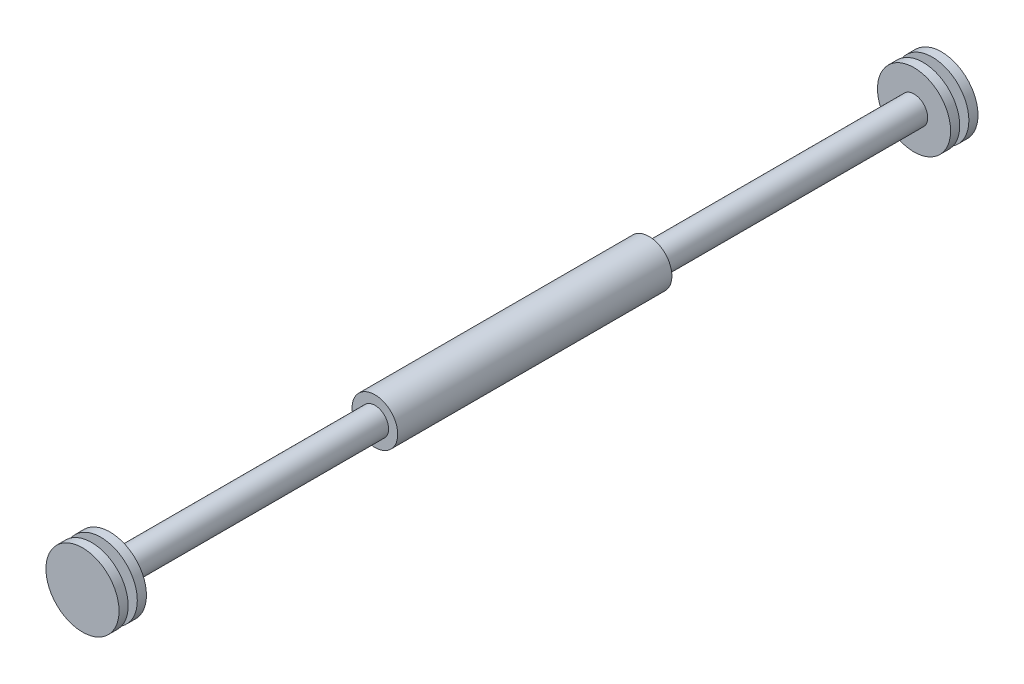
ISO-10303-21;
HEADER;
FILE_DESCRIPTION(('STEP AP214'),'2;1');
FILE_NAME('part.step','',(''),(''),'','','');
FILE_SCHEMA(('AUTOMOTIVE_DESIGN { 1 0 10303 214 1 1 1 1 }'));
ENDSEC;
DATA;
#1=APPLICATION_CONTEXT('core data for automotive mechanical design processes');
#2=APPLICATION_PROTOCOL_DEFINITION('international standard','automotive_design',2000,#1);
#3=PRODUCT_CONTEXT('',#1,'mechanical');
#4=PRODUCT('Part','Part','',(#3));
#5=PRODUCT_RELATED_PRODUCT_CATEGORY('part','',(#4));
#6=PRODUCT_DEFINITION_FORMATION('','',#4);
#7=PRODUCT_DEFINITION_CONTEXT('part definition',#1,'design');
#8=PRODUCT_DEFINITION('design','',#6,#7);
#9=PRODUCT_DEFINITION_SHAPE('','',#8);
#10=(LENGTH_UNIT() NAMED_UNIT(*) SI_UNIT(.MILLI.,.METRE.));
#11=(NAMED_UNIT(*) PLANE_ANGLE_UNIT() SI_UNIT($,.RADIAN.));
#12=(NAMED_UNIT(*) SI_UNIT($,.STERADIAN.) SOLID_ANGLE_UNIT());
#13=UNCERTAINTY_MEASURE_WITH_UNIT(LENGTH_MEASURE(1.E-05),#10,'distance_accuracy_value','');
#14=(GEOMETRIC_REPRESENTATION_CONTEXT(3) GLOBAL_UNCERTAINTY_ASSIGNED_CONTEXT((#13)) GLOBAL_UNIT_ASSIGNED_CONTEXT((#10,
#11,#12)) REPRESENTATION_CONTEXT('',''));
#15=CARTESIAN_POINT('',(0.,0.,0.));
#16=DIRECTION('',(0.,0.,1.));
#17=DIRECTION('',(1.,0.,0.));
#18=AXIS2_PLACEMENT_3D('',#15,#16,#17);
#19=CARTESIAN_POINT('',(0.,0.,180.));
#20=DIRECTION('',(0.,0.,-1.));
#21=DIRECTION('',(-1.,0.,0.));
#22=AXIS2_PLACEMENT_3D('',#19,#20,#21);
#23=CYLINDRICAL_SURFACE('',#22,3.);
#24=CARTESIAN_POINT('',(0.,0.,2.));
#25=DIRECTION('',(0.,0.,1.));
#26=DIRECTION('',(1.,0.,0.));
#27=AXIS2_PLACEMENT_3D('',#24,#25,#26);
#28=CIRCLE('',#27,3.);
#29=CARTESIAN_POINT('',(-3.,0.,1.99999999999997));
#30=VERTEX_POINT('',#29);
#31=EDGE_CURVE('E81',#30,#30,#28,.T.);
#32=CARTESIAN_POINT('',(0.,0.,60.));
#33=DIRECTION('',(0.,0.,1.));
#34=DIRECTION('',(1.,0.,0.));
#35=AXIS2_PLACEMENT_3D('',#32,#33,#34);
#36=CIRCLE('',#35,3.);
#37=CARTESIAN_POINT('',(-3.,0.,60.));
#38=VERTEX_POINT('',#37);
#39=EDGE_CURVE('E10',#38,#38,#36,.T.);
#40=CARTESIAN_POINT('',(-3.,0.,1.99999999999997));
#41=CARTESIAN_POINT('',(-3.,0.,2.60416666666664));
#42=CARTESIAN_POINT('',(-3.,0.,3.2083333333333));
#43=CARTESIAN_POINT('',(-3.,0.,4.41666666666663));
#44=CARTESIAN_POINT('',(-3.,0.,5.0208333333333));
#45=CARTESIAN_POINT('',(-3.,0.,6.22916666666664));
#46=CARTESIAN_POINT('',(-3.,0.,6.83333333333331));
#47=CARTESIAN_POINT('',(-3.,0.,8.04166666666665));
#48=CARTESIAN_POINT('',(-3.,0.,8.64583333333332));
#49=CARTESIAN_POINT('',(-3.,0.,9.85416666666664));
#50=CARTESIAN_POINT('',(-3.,0.,10.4583333333333));
#51=CARTESIAN_POINT('',(-3.,0.,11.6666666666666));
#52=CARTESIAN_POINT('',(-3.,0.,12.2708333333333));
#53=CARTESIAN_POINT('',(-3.,0.,13.4791666666666));
#54=CARTESIAN_POINT('',(-3.,0.,14.0833333333333));
#55=CARTESIAN_POINT('',(-3.,0.,15.2916666666667));
#56=CARTESIAN_POINT('',(-3.,0.,15.8958333333333));
#57=CARTESIAN_POINT('',(-3.,0.,17.1041666666667));
#58=CARTESIAN_POINT('',(-3.,0.,17.7083333333333));
#59=CARTESIAN_POINT('',(-3.,0.,18.9166666666666));
#60=CARTESIAN_POINT('',(-3.,0.,19.5208333333333));
#61=CARTESIAN_POINT('',(-3.,0.,20.7291666666666));
#62=CARTESIAN_POINT('',(-3.,0.,21.3333333333333));
#63=CARTESIAN_POINT('',(-3.,0.,22.5416666666666));
#64=CARTESIAN_POINT('',(-3.,0.,23.1458333333333));
#65=CARTESIAN_POINT('',(-3.,0.,24.3541666666667));
#66=CARTESIAN_POINT('',(-3.,0.,24.9583333333333));
#67=CARTESIAN_POINT('',(-3.,0.,26.1666666666667));
#68=CARTESIAN_POINT('',(-3.,0.,26.7708333333333));
#69=CARTESIAN_POINT('',(-3.,0.,27.9791666666667));
#70=CARTESIAN_POINT('',(-3.,0.,28.5833333333333));
#71=CARTESIAN_POINT('',(-3.,0.,29.7916666666667));
#72=CARTESIAN_POINT('',(-3.,0.,30.3958333333333));
#73=CARTESIAN_POINT('',(-3.,0.,31.6041666666667));
#74=CARTESIAN_POINT('',(-3.,0.,32.2083333333333));
#75=CARTESIAN_POINT('',(-3.,0.,33.4166666666667));
#76=CARTESIAN_POINT('',(-3.,0.,34.0208333333333));
#77=CARTESIAN_POINT('',(-3.,0.,35.2291666666667));
#78=CARTESIAN_POINT('',(-3.,0.,35.8333333333333));
#79=CARTESIAN_POINT('',(-3.,0.,37.0416666666666));
#80=CARTESIAN_POINT('',(-3.,0.,37.6458333333333));
#81=CARTESIAN_POINT('',(-3.,0.,38.8541666666666));
#82=CARTESIAN_POINT('',(-3.,0.,39.4583333333333));
#83=CARTESIAN_POINT('',(-3.,0.,40.6666666666667));
#84=CARTESIAN_POINT('',(-3.,0.,41.2708333333333));
#85=CARTESIAN_POINT('',(-3.,0.,42.4791666666667));
#86=CARTESIAN_POINT('',(-3.,0.,43.0833333333333));
#87=CARTESIAN_POINT('',(-3.,0.,44.2916666666667));
#88=CARTESIAN_POINT('',(-3.,0.,44.8958333333333));
#89=CARTESIAN_POINT('',(-3.,0.,46.1041666666667));
#90=CARTESIAN_POINT('',(-3.,0.,46.7083333333333));
#91=CARTESIAN_POINT('',(-3.,0.,47.9166666666667));
#92=CARTESIAN_POINT('',(-3.,0.,48.5208333333333));
#93=CARTESIAN_POINT('',(-3.,0.,49.7291666666667));
#94=CARTESIAN_POINT('',(-3.,0.,50.3333333333333));
#95=CARTESIAN_POINT('',(-3.,0.,51.5416666666667));
#96=CARTESIAN_POINT('',(-3.,0.,52.1458333333333));
#97=CARTESIAN_POINT('',(-3.,0.,53.3541666666667));
#98=CARTESIAN_POINT('',(-3.,0.,53.9583333333333));
#99=CARTESIAN_POINT('',(-3.,0.,55.1666666666667));
#100=CARTESIAN_POINT('',(-3.,0.,55.7708333333333));
#101=CARTESIAN_POINT('',(-3.,0.,56.9791666666667));
#102=CARTESIAN_POINT('',(-3.,0.,57.5833333333333));
#103=CARTESIAN_POINT('',(-3.,0.,58.7916666666667));
#104=CARTESIAN_POINT('',(-3.,0.,59.3958333333333));
#105=CARTESIAN_POINT('',(-3.,0.,60.));
#106=B_SPLINE_CURVE_WITH_KNOTS('',3,(#40,#41,#42,#43,#44,#45,#46,#47,#48,#49,#50,#51,#52,#53,
#54,#55,#56,#57,#58,#59,#60,#61,#62,#63,#64,#65,#66,#67,#68,#69,#70,#71,#72,#73,#74,#75,#76,#77,
#78,#79,#80,#81,#82,#83,#84,#85,#86,#87,#88,#89,#90,#91,#92,#93,#94,#95,#96,#97,#98,#99,#100,
#101,#102,#103,#104,#105),.UNSPECIFIED.,.F.,.F.,(4,2,2,2,2,2,2,2,2,2,2,2,2,2,2,2,2,2,2,2,2,2,2,
2,2,2,2,2,2,2,2,2,4),(0.,1.81249999999999,3.62499999999999,5.43750000000001,7.25000000000001,
9.0625,10.875,12.6875,14.5,16.3125,18.125,19.9375,21.75,23.5625,25.375,27.1875,29.,30.8125,
32.625,34.4375,36.25,38.0625,39.875,41.6875,43.5,45.3125,47.125,48.9375,50.75,52.5625,54.375,
56.1875,58.),.UNSPECIFIED.);
#107=EDGE_CURVE('BSEAM41',#30,#38,#106,.T.);
#108=ORIENTED_EDGE('',*,*,#31,.T.);
#109=ORIENTED_EDGE('',*,*,#39,.F.);
#110=ORIENTED_EDGE('',*,*,#107,.T.);
#111=ORIENTED_EDGE('',*,*,#107,.F.);
#112=EDGE_LOOP('',(#108,#110,#109,#111));
#113=FACE_BOUND('',#112,.T.);
#114=ADVANCED_FACE('F41',(#113),#23,.T.);
#115=CARTESIAN_POINT('',(0.,0.,2.));
#116=DIRECTION('',(0.,0.,-1.));
#117=DIRECTION('',(-1.,0.,0.));
#118=AXIS2_PLACEMENT_3D('',#115,#116,#117);
#119=CYLINDRICAL_SURFACE('',#118,8.);
#120=CARTESIAN_POINT('',(0.,0.,2.));
#121=DIRECTION('',(0.,0.,1.));
#122=DIRECTION('',(1.,0.,0.));
#123=AXIS2_PLACEMENT_3D('',#120,#121,#122);
#124=CIRCLE('',#123,8.);
#125=CARTESIAN_POINT('',(8.,0.,2.));
#126=VERTEX_POINT('',#125);
#127=EDGE_CURVE('E77',#126,#126,#124,.T.);
#128=ORIENTED_EDGE('',*,*,#127,.F.);
#129=EDGE_LOOP('',(#128));
#130=FACE_BOUND('',#129,.T.);
#131=CARTESIAN_POINT('',(0.,0.,0.));
#132=DIRECTION('',(0.,0.,1.));
#133=DIRECTION('',(1.,0.,0.));
#134=AXIS2_PLACEMENT_3D('',#131,#132,#133);
#135=CIRCLE('',#134,8.);
#136=CARTESIAN_POINT('',(8.,0.,0.));
#137=VERTEX_POINT('',#136);
#138=EDGE_CURVE('E76',#137,#137,#135,.T.);
#139=ORIENTED_EDGE('',*,*,#138,.T.);
#140=EDGE_LOOP('',(#139));
#141=FACE_BOUND('',#140,.T.);
#142=ADVANCED_FACE('F144',(#130,#141),#119,.T.);
#143=CARTESIAN_POINT('',(0.,0.,2.));
#144=DIRECTION('',(0.,0.,1.));
#145=DIRECTION('',(1.,0.,0.));
#146=AXIS2_PLACEMENT_3D('',#143,#144,#145);
#147=PLANE('',#146);
#148=ORIENTED_EDGE('',*,*,#31,.F.);
#149=EDGE_LOOP('',(#148));
#150=FACE_BOUND('',#149,.T.);
#151=ORIENTED_EDGE('',*,*,#127,.T.);
#152=EDGE_LOOP('',(#151));
#153=FACE_BOUND('',#152,.T.);
#154=ADVANCED_FACE('F149',(#150,#153),#147,.T.);
#155=CARTESIAN_POINT('',(0.,0.,0.));
#156=DIRECTION('',(0.,0.,1.));
#157=DIRECTION('',(1.,0.,0.));
#158=AXIS2_PLACEMENT_3D('',#155,#156,#157);
#159=PLANE('',#158);
#160=CARTESIAN_POINT('',(0.,0.,0.));
#161=DIRECTION('',(0.,0.,1.));
#162=DIRECTION('',(1.,0.,0.));
#163=AXIS2_PLACEMENT_3D('',#160,#161,#162);
#164=CIRCLE('',#163,3.);
#165=CARTESIAN_POINT('',(3.,0.,0.));
#166=VERTEX_POINT('',#165);
#167=EDGE_CURVE('E72',#166,#166,#164,.T.);
#168=ORIENTED_EDGE('',*,*,#167,.T.);
#169=EDGE_LOOP('',(#168));
#170=FACE_BOUND('',#169,.T.);
#171=ORIENTED_EDGE('',*,*,#138,.F.);
#172=EDGE_LOOP('',(#171));
#173=FACE_BOUND('',#172,.T.);
#174=ADVANCED_FACE('F176',(#170,#173),#159,.F.);
#175=CARTESIAN_POINT('',(0.,0.,-2.));
#176=DIRECTION('',(0.,0.,1.));
#177=DIRECTION('',(1.,0.,0.));
#178=AXIS2_PLACEMENT_3D('',#175,#176,#177);
#179=CYLINDRICAL_SURFACE('',#178,3.);
#180=CARTESIAN_POINT('',(0.,0.,-2.));
#181=DIRECTION('',(0.,0.,1.));
#182=DIRECTION('',(1.,0.,0.));
#183=AXIS2_PLACEMENT_3D('',#180,#181,#182);
#184=CIRCLE('',#183,3.);
#185=CARTESIAN_POINT('',(3.,0.,-2.));
#186=VERTEX_POINT('',#185);
#187=EDGE_CURVE('E66',#186,#186,#184,.T.);
#188=ORIENTED_EDGE('',*,*,#187,.T.);
#189=EDGE_LOOP('',(#188));
#190=FACE_BOUND('',#189,.T.);
#191=ORIENTED_EDGE('',*,*,#167,.F.);
#192=EDGE_LOOP('',(#191));
#193=FACE_BOUND('',#192,.T.);
#194=ADVANCED_FACE('F178',(#190,#193),#179,.T.);
#195=CARTESIAN_POINT('',(0.,0.,-4.));
#196=DIRECTION('',(0.,0.,1.));
#197=DIRECTION('',(1.,0.,0.));
#198=AXIS2_PLACEMENT_3D('',#195,#196,#197);
#199=CYLINDRICAL_SURFACE('',#198,8.);
#200=CARTESIAN_POINT('',(0.,0.,-4.));
#201=DIRECTION('',(0.,0.,1.));
#202=DIRECTION('',(1.,0.,0.));
#203=AXIS2_PLACEMENT_3D('',#200,#201,#202);
#204=CIRCLE('',#203,8.);
#205=CARTESIAN_POINT('',(8.,0.,-4.));
#206=VERTEX_POINT('',#205);
#207=EDGE_CURVE('E71',#206,#206,#204,.T.);
#208=ORIENTED_EDGE('',*,*,#207,.T.);
#209=EDGE_LOOP('',(#208));
#210=FACE_BOUND('',#209,.T.);
#211=CARTESIAN_POINT('',(0.,0.,-2.));
#212=DIRECTION('',(0.,0.,1.));
#213=DIRECTION('',(1.,0.,0.));
#214=AXIS2_PLACEMENT_3D('',#211,#212,#213);
#215=CIRCLE('',#214,8.);
#216=CARTESIAN_POINT('',(8.,0.,-2.));
#217=VERTEX_POINT('',#216);
#218=EDGE_CURVE('E97',#217,#217,#215,.T.);
#219=ORIENTED_EDGE('',*,*,#218,.F.);
#220=EDGE_LOOP('',(#219));
#221=FACE_BOUND('',#220,.T.);
#222=ADVANCED_FACE('F184',(#210,#221),#199,.T.);
#223=CARTESIAN_POINT('',(0.,0.,-4.));
#224=DIRECTION('',(0.,0.,1.));
#225=DIRECTION('',(1.,0.,0.));
#226=AXIS2_PLACEMENT_3D('',#223,#224,#225);
#227=PLANE('',#226);
#228=ORIENTED_EDGE('',*,*,#207,.F.);
#229=EDGE_LOOP('',(#228));
#230=FACE_BOUND('',#229,.T.);
#231=ADVANCED_FACE('F283',(#230),#227,.F.);
#232=CARTESIAN_POINT('',(0.,0.,-2.));
#233=DIRECTION('',(0.,0.,1.));
#234=DIRECTION('',(1.,0.,0.));
#235=AXIS2_PLACEMENT_3D('',#232,#233,#234);
#236=PLANE('',#235);
#237=ORIENTED_EDGE('',*,*,#187,.F.);
#238=EDGE_LOOP('',(#237));
#239=FACE_BOUND('',#238,.T.);
#240=ORIENTED_EDGE('',*,*,#218,.T.);
#241=EDGE_LOOP('',(#240));
#242=FACE_BOUND('',#241,.T.);
#243=ADVANCED_FACE('F294',(#239,#242),#236,.T.);
#244=CARTESIAN_POINT('',(0.,0.,60.));
#245=DIRECTION('',(0.,0.,1.));
#246=DIRECTION('',(1.,0.,0.));
#247=AXIS2_PLACEMENT_3D('',#244,#245,#246);
#248=CYLINDRICAL_SURFACE('',#247,5.);
#249=CARTESIAN_POINT('',(0.,0.,60.));
#250=DIRECTION('',(0.,0.,1.));
#251=DIRECTION('',(1.,0.,0.));
#252=AXIS2_PLACEMENT_3D('',#249,#250,#251);
#253=CIRCLE('',#252,5.);
#254=CARTESIAN_POINT('',(5.,0.,60.));
#255=VERTEX_POINT('',#254);
#256=EDGE_CURVE('E98',#255,#255,#253,.T.);
#257=ORIENTED_EDGE('',*,*,#256,.T.);
#258=EDGE_LOOP('',(#257));
#259=FACE_BOUND('',#258,.T.);
#260=CARTESIAN_POINT('',(0.,0.,120.));
#261=DIRECTION('',(0.,0.,1.));
#262=DIRECTION('',(1.,0.,0.));
#263=AXIS2_PLACEMENT_3D('',#260,#261,#262);
#264=CIRCLE('',#263,5.);
#265=CARTESIAN_POINT('',(5.,0.,120.));
#266=VERTEX_POINT('',#265);
#267=EDGE_CURVE('E106',#266,#266,#264,.T.);
#268=ORIENTED_EDGE('',*,*,#267,.F.);
#269=EDGE_LOOP('',(#268));
#270=FACE_BOUND('',#269,.T.);
#271=ADVANCED_FACE('F304',(#259,#270),#248,.T.);
#272=CARTESIAN_POINT('',(0.,0.,60.));
#273=DIRECTION('',(0.,0.,1.));
#274=DIRECTION('',(1.,0.,0.));
#275=AXIS2_PLACEMENT_3D('',#272,#273,#274);
#276=PLANE('',#275);
#277=ORIENTED_EDGE('',*,*,#39,.T.);
#278=EDGE_LOOP('',(#277));
#279=FACE_BOUND('',#278,.T.);
#280=ORIENTED_EDGE('',*,*,#256,.F.);
#281=EDGE_LOOP('',(#280));
#282=FACE_BOUND('',#281,.T.);
#283=ADVANCED_FACE('F321',(#279,#282),#276,.F.);
#284=CARTESIAN_POINT('',(0.,0.,120.));
#285=DIRECTION('',(0.,0.,1.));
#286=DIRECTION('',(1.,0.,0.));
#287=AXIS2_PLACEMENT_3D('',#284,#285,#286);
#288=PLANE('',#287);
#289=CARTESIAN_POINT('',(0.,0.,120.));
#290=DIRECTION('',(0.,0.,1.));
#291=DIRECTION('',(1.,0.,0.));
#292=AXIS2_PLACEMENT_3D('',#289,#290,#291);
#293=CIRCLE('',#292,3.);
#294=CARTESIAN_POINT('',(-3.,0.,120.));
#295=VERTEX_POINT('',#294);
#296=EDGE_CURVE('E94',#295,#295,#293,.T.);
#297=ORIENTED_EDGE('',*,*,#296,.F.);
#298=EDGE_LOOP('',(#297));
#299=FACE_BOUND('',#298,.T.);
#300=ORIENTED_EDGE('',*,*,#267,.T.);
#301=EDGE_LOOP('',(#300));
#302=FACE_BOUND('',#301,.T.);
#303=ADVANCED_FACE('F266',(#299,#302),#288,.T.);
#304=CARTESIAN_POINT('',(0.,0.,184.));
#305=DIRECTION('',(0.,0.,1.));
#306=DIRECTION('',(1.,0.,0.));
#307=AXIS2_PLACEMENT_3D('',#304,#305,#306);
#308=PLANE('',#307);
#309=CARTESIAN_POINT('',(0.,0.,184.));
#310=DIRECTION('',(0.,0.,1.));
#311=DIRECTION('',(1.,0.,0.));
#312=AXIS2_PLACEMENT_3D('',#309,#310,#311);
#313=CIRCLE('',#312,8.);
#314=CARTESIAN_POINT('',(8.,0.,184.));
#315=VERTEX_POINT('',#314);
#316=EDGE_CURVE('E117',#315,#315,#313,.T.);
#317=ORIENTED_EDGE('',*,*,#316,.T.);
#318=EDGE_LOOP('',(#317));
#319=FACE_BOUND('',#318,.T.);
#320=ADVANCED_FACE('F138',(#319),#308,.T.);
#321=CARTESIAN_POINT('',(0.,0.,184.));
#322=DIRECTION('',(0.,0.,-1.));
#323=DIRECTION('',(-1.,0.,0.));
#324=AXIS2_PLACEMENT_3D('',#321,#322,#323);
#325=CYLINDRICAL_SURFACE('',#324,8.);
#326=ORIENTED_EDGE('',*,*,#316,.F.);
#327=EDGE_LOOP('',(#326));
#328=FACE_BOUND('',#327,.T.);
#329=CARTESIAN_POINT('',(0.,0.,182.));
#330=DIRECTION('',(0.,0.,1.));
#331=DIRECTION('',(1.,0.,0.));
#332=AXIS2_PLACEMENT_3D('',#329,#330,#331);
#333=CIRCLE('',#332,8.);
#334=CARTESIAN_POINT('',(8.,0.,182.));
#335=VERTEX_POINT('',#334);
#336=EDGE_CURVE('E70',#335,#335,#333,.T.);
#337=ORIENTED_EDGE('',*,*,#336,.T.);
#338=EDGE_LOOP('',(#337));
#339=FACE_BOUND('',#338,.T.);
#340=ADVANCED_FACE('F124',(#328,#339),#325,.T.);
#341=CARTESIAN_POINT('',(0.,0.,182.));
#342=DIRECTION('',(0.,0.,1.));
#343=DIRECTION('',(1.,0.,0.));
#344=AXIS2_PLACEMENT_3D('',#341,#342,#343);
#345=PLANE('',#344);
#346=CARTESIAN_POINT('',(0.,0.,182.));
#347=DIRECTION('',(0.,0.,1.));
#348=DIRECTION('',(1.,0.,0.));
#349=AXIS2_PLACEMENT_3D('',#346,#347,#348);
#350=CIRCLE('',#349,3.);
#351=CARTESIAN_POINT('',(3.,0.,182.));
#352=VERTEX_POINT('',#351);
#353=EDGE_CURVE('E64',#352,#352,#350,.T.);
#354=ORIENTED_EDGE('',*,*,#353,.T.);
#355=EDGE_LOOP('',(#354));
#356=FACE_BOUND('',#355,.T.);
#357=ORIENTED_EDGE('',*,*,#336,.F.);
#358=EDGE_LOOP('',(#357));
#359=FACE_BOUND('',#358,.T.);
#360=ADVANCED_FACE('F126',(#356,#359),#345,.F.);
#361=CARTESIAN_POINT('',(0.,0.,182.));
#362=DIRECTION('',(0.,0.,-1.));
#363=DIRECTION('',(-1.,0.,0.));
#364=AXIS2_PLACEMENT_3D('',#361,#362,#363);
#365=CYLINDRICAL_SURFACE('',#364,3.);
#366=ORIENTED_EDGE('',*,*,#353,.F.);
#367=EDGE_LOOP('',(#366));
#368=FACE_BOUND('',#367,.T.);
#369=CARTESIAN_POINT('',(0.,0.,180.));
#370=DIRECTION('',(0.,0.,1.));
#371=DIRECTION('',(1.,0.,0.));
#372=AXIS2_PLACEMENT_3D('',#369,#370,#371);
#373=CIRCLE('',#372,3.);
#374=CARTESIAN_POINT('',(3.,0.,180.));
#375=VERTEX_POINT('',#374);
#376=EDGE_CURVE('E49',#375,#375,#373,.T.);
#377=ORIENTED_EDGE('',*,*,#376,.T.);
#378=EDGE_LOOP('',(#377));
#379=FACE_BOUND('',#378,.T.);
#380=ADVANCED_FACE('F128',(#368,#379),#365,.T.);
#381=CARTESIAN_POINT('',(0.,0.,180.));
#382=DIRECTION('',(0.,0.,1.));
#383=DIRECTION('',(1.,0.,0.));
#384=AXIS2_PLACEMENT_3D('',#381,#382,#383);
#385=PLANE('',#384);
#386=ORIENTED_EDGE('',*,*,#376,.F.);
#387=EDGE_LOOP('',(#386));
#388=FACE_BOUND('',#387,.T.);
#389=CARTESIAN_POINT('',(0.,0.,180.));
#390=DIRECTION('',(0.,0.,1.));
#391=DIRECTION('',(1.,0.,0.));
#392=AXIS2_PLACEMENT_3D('',#389,#390,#391);
#393=CIRCLE('',#392,8.);
#394=CARTESIAN_POINT('',(8.,0.,180.));
#395=VERTEX_POINT('',#394);
#396=EDGE_CURVE('E88',#395,#395,#393,.T.);
#397=ORIENTED_EDGE('',*,*,#396,.T.);
#398=EDGE_LOOP('',(#397));
#399=FACE_BOUND('',#398,.T.);
#400=ADVANCED_FACE('F135',(#388,#399),#385,.T.);
#401=CARTESIAN_POINT('',(0.,0.,178.));
#402=DIRECTION('',(0.,0.,1.));
#403=DIRECTION('',(1.,0.,0.));
#404=AXIS2_PLACEMENT_3D('',#401,#402,#403);
#405=CYLINDRICAL_SURFACE('',#404,8.);
#406=CARTESIAN_POINT('',(0.,0.,178.));
#407=DIRECTION('',(0.,0.,1.));
#408=DIRECTION('',(1.,0.,0.));
#409=AXIS2_PLACEMENT_3D('',#406,#407,#408);
#410=CIRCLE('',#409,8.);
#411=CARTESIAN_POINT('',(8.,0.,178.));
#412=VERTEX_POINT('',#411);
#413=EDGE_CURVE('E60',#412,#412,#410,.T.);
#414=ORIENTED_EDGE('',*,*,#413,.T.);
#415=EDGE_LOOP('',(#414));
#416=FACE_BOUND('',#415,.T.);
#417=ORIENTED_EDGE('',*,*,#396,.F.);
#418=EDGE_LOOP('',(#417));
#419=FACE_BOUND('',#418,.T.);
#420=ADVANCED_FACE('F158',(#416,#419),#405,.T.);
#421=CARTESIAN_POINT('',(0.,0.,178.));
#422=DIRECTION('',(0.,0.,1.));
#423=DIRECTION('',(1.,0.,0.));
#424=AXIS2_PLACEMENT_3D('',#421,#422,#423);
#425=PLANE('',#424);
#426=CARTESIAN_POINT('',(0.,0.,178.));
#427=DIRECTION('',(0.,0.,1.));
#428=DIRECTION('',(1.,0.,0.));
#429=AXIS2_PLACEMENT_3D('',#426,#427,#428);
#430=CIRCLE('',#429,3.);
#431=CARTESIAN_POINT('',(-3.,0.,178.));
#432=VERTEX_POINT('',#431);
#433=EDGE_CURVE('E54',#432,#432,#430,.T.);
#434=ORIENTED_EDGE('',*,*,#433,.T.);
#435=EDGE_LOOP('',(#434));
#436=FACE_BOUND('',#435,.T.);
#437=ORIENTED_EDGE('',*,*,#413,.F.);
#438=EDGE_LOOP('',(#437));
#439=FACE_BOUND('',#438,.T.);
#440=ADVANCED_FACE('F154',(#436,#439),#425,.F.);
#441=CARTESIAN_POINT('',(-3.,0.,120.));
#442=CARTESIAN_POINT('',(-3.,0.,120.604166666667));
#443=CARTESIAN_POINT('',(-3.,0.,121.208333333333));
#444=CARTESIAN_POINT('',(-3.,0.,122.416666666667));
#445=CARTESIAN_POINT('',(-3.,0.,123.020833333333));
#446=CARTESIAN_POINT('',(-3.,0.,124.229166666667));
#447=CARTESIAN_POINT('',(-3.,0.,124.833333333333));
#448=CARTESIAN_POINT('',(-3.,0.,126.041666666667));
#449=CARTESIAN_POINT('',(-3.,0.,126.645833333333));
#450=CARTESIAN_POINT('',(-3.,0.,127.854166666667));
#451=CARTESIAN_POINT('',(-3.,0.,128.458333333333));
#452=CARTESIAN_POINT('',(-3.,0.,129.666666666667));
#453=CARTESIAN_POINT('',(-3.,0.,130.270833333333));
#454=CARTESIAN_POINT('',(-3.,0.,131.479166666667));
#455=CARTESIAN_POINT('',(-3.,0.,132.083333333333));
#456=CARTESIAN_POINT('',(-3.,0.,133.291666666667));
#457=CARTESIAN_POINT('',(-3.,0.,133.895833333333));
#458=CARTESIAN_POINT('',(-3.,0.,135.104166666667));
#459=CARTESIAN_POINT('',(-3.,0.,135.708333333333));
#460=CARTESIAN_POINT('',(-3.,0.,136.916666666667));
#461=CARTESIAN_POINT('',(-3.,0.,137.520833333333));
#462=CARTESIAN_POINT('',(-3.,0.,138.729166666667));
#463=CARTESIAN_POINT('',(-3.,0.,139.333333333333));
#464=CARTESIAN_POINT('',(-3.,0.,140.541666666667));
#465=CARTESIAN_POINT('',(-3.,0.,141.145833333333));
#466=CARTESIAN_POINT('',(-3.,0.,142.354166666667));
#467=CARTESIAN_POINT('',(-3.,0.,142.958333333333));
#468=CARTESIAN_POINT('',(-3.,0.,144.166666666667));
#469=CARTESIAN_POINT('',(-3.,0.,144.770833333333));
#470=CARTESIAN_POINT('',(-3.,0.,145.979166666667));
#471=CARTESIAN_POINT('',(-3.,0.,146.583333333333));
#472=CARTESIAN_POINT('',(-3.,0.,147.791666666667));
#473=CARTESIAN_POINT('',(-3.,0.,148.395833333333));
#474=CARTESIAN_POINT('',(-3.,0.,149.604166666667));
#475=CARTESIAN_POINT('',(-3.,0.,150.208333333333));
#476=CARTESIAN_POINT('',(-3.,0.,151.416666666667));
#477=CARTESIAN_POINT('',(-3.,0.,152.020833333333));
#478=CARTESIAN_POINT('',(-3.,0.,153.229166666667));
#479=CARTESIAN_POINT('',(-3.,0.,153.833333333333));
#480=CARTESIAN_POINT('',(-3.,0.,155.041666666667));
#481=CARTESIAN_POINT('',(-3.,0.,155.645833333333));
#482=CARTESIAN_POINT('',(-3.,0.,156.854166666667));
#483=CARTESIAN_POINT('',(-3.,0.,157.458333333333));
#484=CARTESIAN_POINT('',(-3.,0.,158.666666666667));
#485=CARTESIAN_POINT('',(-3.,0.,159.270833333333));
#486=CARTESIAN_POINT('',(-3.,0.,160.479166666667));
#487=CARTESIAN_POINT('',(-3.,0.,161.083333333333));
#488=CARTESIAN_POINT('',(-3.,0.,162.291666666667));
#489=CARTESIAN_POINT('',(-3.,0.,162.895833333333));
#490=CARTESIAN_POINT('',(-3.,0.,164.104166666667));
#491=CARTESIAN_POINT('',(-3.,0.,164.708333333333));
#492=CARTESIAN_POINT('',(-3.,0.,165.916666666667));
#493=CARTESIAN_POINT('',(-3.,0.,166.520833333333));
#494=CARTESIAN_POINT('',(-3.,0.,167.729166666667));
#495=CARTESIAN_POINT('',(-3.,0.,168.333333333333));
#496=CARTESIAN_POINT('',(-3.,0.,169.541666666667));
#497=CARTESIAN_POINT('',(-3.,0.,170.145833333333));
#498=CARTESIAN_POINT('',(-3.,0.,171.354166666667));
#499=CARTESIAN_POINT('',(-3.,0.,171.958333333333));
#500=CARTESIAN_POINT('',(-3.,0.,173.166666666667));
#501=CARTESIAN_POINT('',(-3.,0.,173.770833333333));
#502=CARTESIAN_POINT('',(-3.,0.,174.979166666667));
#503=CARTESIAN_POINT('',(-3.,0.,175.583333333333));
#504=CARTESIAN_POINT('',(-3.,0.,176.791666666667));
#505=CARTESIAN_POINT('',(-3.,0.,177.395833333333));
#506=CARTESIAN_POINT('',(-3.,0.,178.));
#507=B_SPLINE_CURVE_WITH_KNOTS('',3,(#441,#442,#443,#444,#445,#446,#447,#448,#449,#450,#451,
#452,#453,#454,#455,#456,#457,#458,#459,#460,#461,#462,#463,#464,#465,#466,#467,#468,#469,#470,
#471,#472,#473,#474,#475,#476,#477,#478,#479,#480,#481,#482,#483,#484,#485,#486,#487,#488,#489,
#490,#491,#492,#493,#494,#495,#496,#497,#498,#499,#500,#501,#502,#503,#504,#505,#506),
.UNSPECIFIED.,.F.,.F.,(4,2,2,2,2,2,2,2,2,2,2,2,2,2,2,2,2,2,2,2,2,2,2,2,2,2,2,2,2,2,2,2,4),(0.,
1.81249999999999,3.62499999999999,5.43749999999998,7.24999999999998,9.0625,10.875,12.6875,14.5,
16.3125,18.125,19.9375,21.75,23.5625,25.375,27.1875,29.,30.8125,32.625,34.4375,36.25,38.0625,
39.875,41.6875,43.5,45.3125,47.125,48.9375,50.75,52.5625,54.375,56.1875,58.),.UNSPECIFIED.);
#508=EDGE_CURVE('BSEAM43',#295,#432,#507,.T.);
#509=ORIENTED_EDGE('',*,*,#296,.T.);
#510=ORIENTED_EDGE('',*,*,#433,.F.);
#511=ORIENTED_EDGE('',*,*,#508,.T.);
#512=ORIENTED_EDGE('',*,*,#508,.F.);
#513=EDGE_LOOP('',(#509,#511,#510,#512));
#514=FACE_BOUND('',#513,.T.);
#515=ADVANCED_FACE('F43',(#514),#23,.T.);
#516=CLOSED_SHELL('',(#114,#142,#154,#174,#194,#222,#231,#243,#271,#283,#303,#320,#340,#360,
#380,#400,#420,#440,#515));
#517=MANIFOLD_SOLID_BREP('B2',#516);
#518=ADVANCED_BREP_SHAPE_REPRESENTATION('',(#18,#517),#14);
#519=SHAPE_DEFINITION_REPRESENTATION(#9,#518);
ENDSEC;
END-ISO-10303-21;
